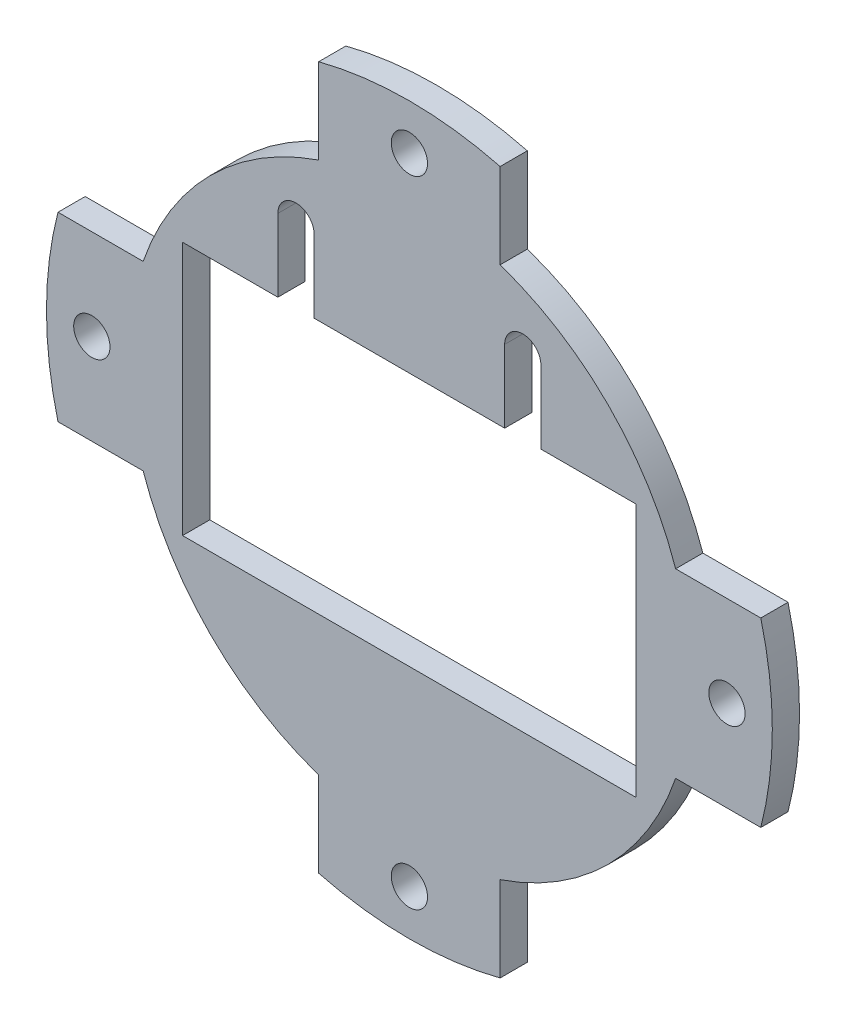
ISO-10303-21;
HEADER;
FILE_DESCRIPTION(('STEP AP214'),'2;1');
FILE_NAME('part.step','',(''),(''),'','','');
FILE_SCHEMA(('AUTOMOTIVE_DESIGN { 1 0 10303 214 1 1 1 1 }'));
ENDSEC;
DATA;
#1=APPLICATION_CONTEXT('core data for automotive mechanical design processes');
#2=APPLICATION_PROTOCOL_DEFINITION('international standard','automotive_design',2000,#1);
#3=PRODUCT_CONTEXT('',#1,'mechanical');
#4=PRODUCT('Part','Part','',(#3));
#5=PRODUCT_RELATED_PRODUCT_CATEGORY('part','',(#4));
#6=PRODUCT_DEFINITION_FORMATION('','',#4);
#7=PRODUCT_DEFINITION_CONTEXT('part definition',#1,'design');
#8=PRODUCT_DEFINITION('design','',#6,#7);
#9=PRODUCT_DEFINITION_SHAPE('','',#8);
#10=(LENGTH_UNIT() NAMED_UNIT(*) SI_UNIT(.MILLI.,.METRE.));
#11=(NAMED_UNIT(*) PLANE_ANGLE_UNIT() SI_UNIT($,.RADIAN.));
#12=(NAMED_UNIT(*) SI_UNIT($,.STERADIAN.) SOLID_ANGLE_UNIT());
#13=UNCERTAINTY_MEASURE_WITH_UNIT(LENGTH_MEASURE(1.E-05),#10,'distance_accuracy_value','');
#14=(GEOMETRIC_REPRESENTATION_CONTEXT(3) GLOBAL_UNCERTAINTY_ASSIGNED_CONTEXT((#13)) GLOBAL_UNIT_ASSIGNED_CONTEXT((#10,
#11,#12)) REPRESENTATION_CONTEXT('',''));
#15=CARTESIAN_POINT('',(0.,0.,0.));
#16=DIRECTION('',(0.,0.,1.));
#17=DIRECTION('',(1.,0.,0.));
#18=AXIS2_PLACEMENT_3D('',#15,#16,#17);
#19=CARTESIAN_POINT('',(25.,14.,-0.00100000000000013));
#20=DIRECTION('',(0.,1.,0.));
#21=DIRECTION('',(-1.,0.,0.));
#22=AXIS2_PLACEMENT_3D('',#19,#20,#21);
#23=PLANE('',#22);
#24=DIRECTION('',(-1.,0.,0.));
#25=VECTOR('',#24,1.);
#26=CARTESIAN_POINT('',(25.,14.,3.));
#27=LINE('',#26,#25);
#28=CARTESIAN_POINT('',(10.5,14.,3.));
#29=VERTEX_POINT('',#28);
#30=CARTESIAN_POINT('',(-10.5,14.,3.));
#31=VERTEX_POINT('',#30);
#32=EDGE_CURVE('E302',#29,#31,#27,.T.);
#33=ORIENTED_EDGE('',*,*,#32,.T.);
#34=DIRECTION('',(0.,0.,1.));
#35=VECTOR('',#34,1.);
#36=CARTESIAN_POINT('',(-10.5,14.,-0.00100000000000013));
#37=LINE('',#36,#35);
#38=CARTESIAN_POINT('',(-10.5,14.,0.));
#39=VERTEX_POINT('',#38);
#40=EDGE_CURVE('E259',#39,#31,#37,.T.);
#41=ORIENTED_EDGE('',*,*,#40,.F.);
#42=DIRECTION('',(1.,0.,0.));
#43=VECTOR('',#42,1.);
#44=CARTESIAN_POINT('',(25.,14.,0.));
#45=LINE('',#44,#43);
#46=CARTESIAN_POINT('',(10.5,14.,0.));
#47=VERTEX_POINT('',#46);
#48=EDGE_CURVE('E286',#39,#47,#45,.T.);
#49=ORIENTED_EDGE('',*,*,#48,.T.);
#50=DIRECTION('',(0.,0.,1.));
#51=VECTOR('',#50,1.);
#52=CARTESIAN_POINT('',(10.5,14.,-0.00100000000000013));
#53=LINE('',#52,#51);
#54=EDGE_CURVE('E278',#47,#29,#53,.T.);
#55=ORIENTED_EDGE('',*,*,#54,.T.);
#56=EDGE_LOOP('',(#33,#41,#49,#55));
#57=FACE_BOUND('',#56,.T.);
#58=ADVANCED_FACE('F33',(#57),#23,.F.);
#59=CARTESIAN_POINT('',(25.,14.,3.));
#60=VERTEX_POINT('',#59);
#61=CARTESIAN_POINT('',(14.5,14.,3.));
#62=VERTEX_POINT('',#61);
#63=EDGE_CURVE('E298',#60,#62,#27,.T.);
#64=ORIENTED_EDGE('',*,*,#63,.T.);
#65=DIRECTION('',(0.,0.,1.));
#66=VECTOR('',#65,1.);
#67=CARTESIAN_POINT('',(14.5,14.,-0.00100000000000013));
#68=LINE('',#67,#66);
#69=CARTESIAN_POINT('',(14.5,14.,0.));
#70=VERTEX_POINT('',#69);
#71=EDGE_CURVE('E276',#70,#62,#68,.T.);
#72=ORIENTED_EDGE('',*,*,#71,.F.);
#73=CARTESIAN_POINT('',(25.,14.,0.));
#74=VERTEX_POINT('',#73);
#75=EDGE_CURVE('E282',#70,#74,#45,.T.);
#76=ORIENTED_EDGE('',*,*,#75,.T.);
#77=DIRECTION('',(0.,0.,1.));
#78=VECTOR('',#77,1.);
#79=CARTESIAN_POINT('',(25.,14.,-0.00100000000000013));
#80=LINE('',#79,#78);
#81=EDGE_CURVE('E307',#74,#60,#80,.T.);
#82=ORIENTED_EDGE('',*,*,#81,.T.);
#83=EDGE_LOOP('',(#64,#72,#76,#82));
#84=FACE_BOUND('',#83,.T.);
#85=ADVANCED_FACE('F452',(#84),#23,.F.);
#86=CARTESIAN_POINT('',(0.,0.,3.));
#87=DIRECTION('',(0.,0.,-1.));
#88=DIRECTION('',(-1.,0.,0.));
#89=AXIS2_PLACEMENT_3D('',#86,#87,#88);
#90=CYLINDRICAL_SURFACE('',#89,40.);
#91=CARTESIAN_POINT('',(0.,0.,0.));
#92=DIRECTION('',(0.,0.,1.));
#93=DIRECTION('',(1.,0.,0.));
#94=AXIS2_PLACEMENT_3D('',#91,#92,#93);
#95=CIRCLE('',#94,40.);
#96=CARTESIAN_POINT('',(10.,38.7298334620742,0.));
#97=VERTEX_POINT('',#96);
#98=CARTESIAN_POINT('',(-10.,38.7298334620742,0.));
#99=VERTEX_POINT('',#98);
#100=EDGE_CURVE('E315',#97,#99,#95,.T.);
#101=ORIENTED_EDGE('',*,*,#100,.T.);
#102=DIRECTION('',(0.,0.,-1.));
#103=VECTOR('',#102,1.);
#104=CARTESIAN_POINT('',(-10.,38.7298334620742,3.));
#105=LINE('',#104,#103);
#106=CARTESIAN_POINT('',(-10.,38.7298334620742,3.));
#107=VERTEX_POINT('',#106);
#108=EDGE_CURVE('E11',#107,#99,#105,.T.);
#109=ORIENTED_EDGE('',*,*,#108,.F.);
#110=CARTESIAN_POINT('',(0.,0.,3.));
#111=DIRECTION('',(0.,0.,1.));
#112=DIRECTION('',(1.,0.,0.));
#113=AXIS2_PLACEMENT_3D('',#110,#111,#112);
#114=CIRCLE('',#113,40.);
#115=CARTESIAN_POINT('',(10.,38.7298334620742,3.));
#116=VERTEX_POINT('',#115);
#117=EDGE_CURVE('E316',#116,#107,#114,.T.);
#118=ORIENTED_EDGE('',*,*,#117,.F.);
#119=DIRECTION('',(0.,0.,-1.));
#120=VECTOR('',#119,1.);
#121=CARTESIAN_POINT('',(10.,38.7298334620742,3.));
#122=LINE('',#121,#120);
#123=EDGE_CURVE('E350',#116,#97,#122,.T.);
#124=ORIENTED_EDGE('',*,*,#123,.T.);
#125=EDGE_LOOP('',(#101,#109,#118,#124));
#126=FACE_BOUND('',#125,.T.);
#127=ADVANCED_FACE('F35',(#126),#90,.T.);
#128=CARTESIAN_POINT('',(-10.,29.3428015022424,3.));
#129=DIRECTION('',(1.,0.,0.));
#130=DIRECTION('',(0.,0.,-1.));
#131=AXIS2_PLACEMENT_3D('',#128,#129,#130);
#132=PLANE('',#131);
#133=DIRECTION('',(0.,-1.,0.));
#134=VECTOR('',#133,1.);
#135=CARTESIAN_POINT('',(-10.,29.3428015022424,0.));
#136=LINE('',#135,#134);
#137=CARTESIAN_POINT('',(-10.,29.3428015022424,0.));
#138=VERTEX_POINT('',#137);
#139=EDGE_CURVE('E353',#99,#138,#136,.T.);
#140=ORIENTED_EDGE('',*,*,#139,.T.);
#141=DIRECTION('',(0.,0.,-1.));
#142=VECTOR('',#141,1.);
#143=CARTESIAN_POINT('',(-10.,29.3428015022424,3.));
#144=LINE('',#143,#142);
#145=CARTESIAN_POINT('',(-10.,29.3428015022424,3.));
#146=VERTEX_POINT('',#145);
#147=EDGE_CURVE('E42',#146,#138,#144,.T.);
#148=ORIENTED_EDGE('',*,*,#147,.F.);
#149=DIRECTION('',(0.,-1.,0.));
#150=VECTOR('',#149,1.);
#151=CARTESIAN_POINT('',(-10.,29.3428015022424,3.));
#152=LINE('',#151,#150);
#153=EDGE_CURVE('E319',#107,#146,#152,.T.);
#154=ORIENTED_EDGE('',*,*,#153,.F.);
#155=ORIENTED_EDGE('',*,*,#108,.T.);
#156=EDGE_LOOP('',(#140,#148,#154,#155));
#157=FACE_BOUND('',#156,.T.);
#158=ADVANCED_FACE('F600',(#157),#132,.F.);
#159=CARTESIAN_POINT('',(0.,0.,3.));
#160=DIRECTION('',(0.,0.,-1.));
#161=DIRECTION('',(-1.,0.,0.));
#162=AXIS2_PLACEMENT_3D('',#159,#160,#161);
#163=CYLINDRICAL_SURFACE('',#162,31.);
#164=CARTESIAN_POINT('',(0.,0.,0.));
#165=DIRECTION('',(0.,0.,1.));
#166=DIRECTION('',(1.,0.,0.));
#167=AXIS2_PLACEMENT_3D('',#164,#165,#166);
#168=CIRCLE('',#167,31.);
#169=CARTESIAN_POINT('',(-29.3428015022423,10.0000000000003,0.));
#170=VERTEX_POINT('',#169);
#171=EDGE_CURVE('E355',#138,#170,#168,.T.);
#172=ORIENTED_EDGE('',*,*,#171,.T.);
#173=DIRECTION('',(0.,0.,-1.));
#174=VECTOR('',#173,1.);
#175=CARTESIAN_POINT('',(-29.3428015022423,10.0000000000003,3.));
#176=LINE('',#175,#174);
#177=CARTESIAN_POINT('',(-29.3428015022423,10.0000000000003,3.));
#178=VERTEX_POINT('',#177);
#179=EDGE_CURVE('E420',#178,#170,#176,.T.);
#180=ORIENTED_EDGE('',*,*,#179,.F.);
#181=CARTESIAN_POINT('',(0.,0.,3.));
#182=DIRECTION('',(0.,0.,1.));
#183=DIRECTION('',(1.,0.,0.));
#184=AXIS2_PLACEMENT_3D('',#181,#182,#183);
#185=CIRCLE('',#184,31.);
#186=EDGE_CURVE('E322',#146,#178,#185,.T.);
#187=ORIENTED_EDGE('',*,*,#186,.F.);
#188=ORIENTED_EDGE('',*,*,#147,.T.);
#189=EDGE_LOOP('',(#172,#180,#187,#188));
#190=FACE_BOUND('',#189,.T.);
#191=ADVANCED_FACE('F597',(#190),#163,.T.);
#192=CARTESIAN_POINT('',(-29.3428015022423,10.0000000000003,3.));
#193=DIRECTION('',(0.,-1.,0.));
#194=DIRECTION('',(1.,0.,0.));
#195=AXIS2_PLACEMENT_3D('',#192,#193,#194);
#196=PLANE('',#195);
#197=DIRECTION('',(-1.,0.,0.));
#198=VECTOR('',#197,1.);
#199=CARTESIAN_POINT('',(-29.3428015022423,10.0000000000003,0.));
#200=LINE('',#199,#198);
#201=CARTESIAN_POINT('',(-38.7298334620741,10.0000000000004,0.));
#202=VERTEX_POINT('',#201);
#203=EDGE_CURVE('E357',#170,#202,#200,.T.);
#204=ORIENTED_EDGE('',*,*,#203,.T.);
#205=DIRECTION('',(0.,0.,-1.));
#206=VECTOR('',#205,1.);
#207=CARTESIAN_POINT('',(-38.7298334620741,10.0000000000004,3.));
#208=LINE('',#207,#206);
#209=CARTESIAN_POINT('',(-38.7298334620741,10.0000000000004,3.));
#210=VERTEX_POINT('',#209);
#211=EDGE_CURVE('E417',#210,#202,#208,.T.);
#212=ORIENTED_EDGE('',*,*,#211,.F.);
#213=DIRECTION('',(-1.,0.,0.));
#214=VECTOR('',#213,1.);
#215=CARTESIAN_POINT('',(-29.3428015022423,10.0000000000003,3.));
#216=LINE('',#215,#214);
#217=EDGE_CURVE('E324',#178,#210,#216,.T.);
#218=ORIENTED_EDGE('',*,*,#217,.F.);
#219=ORIENTED_EDGE('',*,*,#179,.T.);
#220=EDGE_LOOP('',(#204,#212,#218,#219));
#221=FACE_BOUND('',#220,.T.);
#222=ADVANCED_FACE('F593',(#221),#196,.F.);
#223=CARTESIAN_POINT('',(0.,0.,3.));
#224=DIRECTION('',(0.,0.,-1.));
#225=DIRECTION('',(-1.,0.,0.));
#226=AXIS2_PLACEMENT_3D('',#223,#224,#225);
#227=CYLINDRICAL_SURFACE('',#226,40.);
#228=CARTESIAN_POINT('',(0.,0.,0.));
#229=DIRECTION('',(0.,0.,1.));
#230=DIRECTION('',(1.,0.,0.));
#231=AXIS2_PLACEMENT_3D('',#228,#229,#230);
#232=CIRCLE('',#231,40.);
#233=CARTESIAN_POINT('',(-38.7298334620743,-9.99999999999959,0.));
#234=VERTEX_POINT('',#233);
#235=EDGE_CURVE('E359',#202,#234,#232,.T.);
#236=ORIENTED_EDGE('',*,*,#235,.T.);
#237=DIRECTION('',(0.,0.,-1.));
#238=VECTOR('',#237,1.);
#239=CARTESIAN_POINT('',(-38.7298334620743,-9.99999999999959,3.));
#240=LINE('',#239,#238);
#241=CARTESIAN_POINT('',(-38.7298334620743,-9.99999999999959,3.));
#242=VERTEX_POINT('',#241);
#243=EDGE_CURVE('E414',#242,#234,#240,.T.);
#244=ORIENTED_EDGE('',*,*,#243,.F.);
#245=CARTESIAN_POINT('',(0.,0.,3.));
#246=DIRECTION('',(0.,0.,1.));
#247=DIRECTION('',(1.,0.,0.));
#248=AXIS2_PLACEMENT_3D('',#245,#246,#247);
#249=CIRCLE('',#248,40.);
#250=EDGE_CURVE('E326',#210,#242,#249,.T.);
#251=ORIENTED_EDGE('',*,*,#250,.F.);
#252=ORIENTED_EDGE('',*,*,#211,.T.);
#253=EDGE_LOOP('',(#236,#244,#251,#252));
#254=FACE_BOUND('',#253,.T.);
#255=ADVANCED_FACE('F589',(#254),#227,.T.);
#256=CARTESIAN_POINT('',(-29.3428015022425,-9.9999999999997,3.));
#257=DIRECTION('',(0.,1.,0.));
#258=DIRECTION('',(-1.,0.,0.));
#259=AXIS2_PLACEMENT_3D('',#256,#257,#258);
#260=PLANE('',#259);
#261=DIRECTION('',(1.,0.,0.));
#262=VECTOR('',#261,1.);
#263=CARTESIAN_POINT('',(-29.3428015022425,-9.9999999999997,0.));
#264=LINE('',#263,#262);
#265=CARTESIAN_POINT('',(-29.3428015022425,-9.9999999999997,0.));
#266=VERTEX_POINT('',#265);
#267=EDGE_CURVE('E361',#234,#266,#264,.T.);
#268=ORIENTED_EDGE('',*,*,#267,.T.);
#269=DIRECTION('',(0.,0.,-1.));
#270=VECTOR('',#269,1.);
#271=CARTESIAN_POINT('',(-29.3428015022425,-9.9999999999997,3.));
#272=LINE('',#271,#270);
#273=CARTESIAN_POINT('',(-29.3428015022425,-9.9999999999997,3.));
#274=VERTEX_POINT('',#273);
#275=EDGE_CURVE('E411',#274,#266,#272,.T.);
#276=ORIENTED_EDGE('',*,*,#275,.F.);
#277=DIRECTION('',(1.,0.,0.));
#278=VECTOR('',#277,1.);
#279=CARTESIAN_POINT('',(-29.3428015022425,-9.9999999999997,3.));
#280=LINE('',#279,#278);
#281=EDGE_CURVE('E328',#242,#274,#280,.T.);
#282=ORIENTED_EDGE('',*,*,#281,.F.);
#283=ORIENTED_EDGE('',*,*,#243,.T.);
#284=EDGE_LOOP('',(#268,#276,#282,#283));
#285=FACE_BOUND('',#284,.T.);
#286=ADVANCED_FACE('F585',(#285),#260,.F.);
#287=CARTESIAN_POINT('',(0.,0.,3.));
#288=DIRECTION('',(0.,0.,-1.));
#289=DIRECTION('',(-1.,0.,0.));
#290=AXIS2_PLACEMENT_3D('',#287,#288,#289);
#291=CYLINDRICAL_SURFACE('',#290,31.);
#292=CARTESIAN_POINT('',(0.,0.,0.));
#293=DIRECTION('',(0.,0.,1.));
#294=DIRECTION('',(1.,0.,0.));
#295=AXIS2_PLACEMENT_3D('',#292,#293,#294);
#296=CIRCLE('',#295,31.);
#297=CARTESIAN_POINT('',(-10.0000000000002,-29.3428015022423,0.));
#298=VERTEX_POINT('',#297);
#299=EDGE_CURVE('E363',#266,#298,#296,.T.);
#300=ORIENTED_EDGE('',*,*,#299,.T.);
#301=DIRECTION('',(0.,0.,-1.));
#302=VECTOR('',#301,1.);
#303=CARTESIAN_POINT('',(-10.0000000000002,-29.3428015022423,3.));
#304=LINE('',#303,#302);
#305=CARTESIAN_POINT('',(-10.0000000000002,-29.3428015022423,3.));
#306=VERTEX_POINT('',#305);
#307=EDGE_CURVE('E408',#306,#298,#304,.T.);
#308=ORIENTED_EDGE('',*,*,#307,.F.);
#309=CARTESIAN_POINT('',(0.,0.,3.));
#310=DIRECTION('',(0.,0.,1.));
#311=DIRECTION('',(1.,0.,0.));
#312=AXIS2_PLACEMENT_3D('',#309,#310,#311);
#313=CIRCLE('',#312,31.);
#314=EDGE_CURVE('E330',#274,#306,#313,.T.);
#315=ORIENTED_EDGE('',*,*,#314,.F.);
#316=ORIENTED_EDGE('',*,*,#275,.T.);
#317=EDGE_LOOP('',(#300,#308,#315,#316));
#318=FACE_BOUND('',#317,.T.);
#319=ADVANCED_FACE('F581',(#318),#291,.T.);
#320=CARTESIAN_POINT('',(-10.0000000000002,-29.3428015022423,3.));
#321=DIRECTION('',(1.,0.,0.));
#322=DIRECTION('',(0.,1.,0.));
#323=AXIS2_PLACEMENT_3D('',#320,#321,#322);
#324=PLANE('',#323);
#325=DIRECTION('',(0.,-1.,0.));
#326=VECTOR('',#325,1.);
#327=CARTESIAN_POINT('',(-10.0000000000002,-29.3428015022423,0.));
#328=LINE('',#327,#326);
#329=CARTESIAN_POINT('',(-10.0000000000003,-38.7298334620741,0.));
#330=VERTEX_POINT('',#329);
#331=EDGE_CURVE('E365',#298,#330,#328,.T.);
#332=ORIENTED_EDGE('',*,*,#331,.T.);
#333=DIRECTION('',(0.,0.,-1.));
#334=VECTOR('',#333,1.);
#335=CARTESIAN_POINT('',(-10.0000000000003,-38.7298334620741,3.));
#336=LINE('',#335,#334);
#337=CARTESIAN_POINT('',(-10.0000000000003,-38.7298334620741,3.));
#338=VERTEX_POINT('',#337);
#339=EDGE_CURVE('E405',#338,#330,#336,.T.);
#340=ORIENTED_EDGE('',*,*,#339,.F.);
#341=DIRECTION('',(0.,-1.,0.));
#342=VECTOR('',#341,1.);
#343=CARTESIAN_POINT('',(-10.0000000000002,-29.3428015022423,3.));
#344=LINE('',#343,#342);
#345=EDGE_CURVE('E332',#306,#338,#344,.T.);
#346=ORIENTED_EDGE('',*,*,#345,.F.);
#347=ORIENTED_EDGE('',*,*,#307,.T.);
#348=EDGE_LOOP('',(#332,#340,#346,#347));
#349=FACE_BOUND('',#348,.T.);
#350=ADVANCED_FACE('F577',(#349),#324,.F.);
#351=CARTESIAN_POINT('',(0.,0.,3.));
#352=DIRECTION('',(0.,0.,-1.));
#353=DIRECTION('',(-1.,0.,0.));
#354=AXIS2_PLACEMENT_3D('',#351,#352,#353);
#355=CYLINDRICAL_SURFACE('',#354,40.);
#356=CARTESIAN_POINT('',(0.,0.,0.));
#357=DIRECTION('',(0.,0.,1.));
#358=DIRECTION('',(1.,0.,0.));
#359=AXIS2_PLACEMENT_3D('',#356,#357,#358);
#360=CIRCLE('',#359,40.);
#361=CARTESIAN_POINT('',(9.99999999999972,-38.7298334620742,0.));
#362=VERTEX_POINT('',#361);
#363=EDGE_CURVE('E367',#330,#362,#360,.T.);
#364=ORIENTED_EDGE('',*,*,#363,.T.);
#365=DIRECTION('',(0.,0.,-1.));
#366=VECTOR('',#365,1.);
#367=CARTESIAN_POINT('',(9.99999999999972,-38.7298334620742,3.));
#368=LINE('',#367,#366);
#369=CARTESIAN_POINT('',(9.99999999999972,-38.7298334620742,3.));
#370=VERTEX_POINT('',#369);
#371=EDGE_CURVE('E402',#370,#362,#368,.T.);
#372=ORIENTED_EDGE('',*,*,#371,.F.);
#373=CARTESIAN_POINT('',(0.,0.,3.));
#374=DIRECTION('',(0.,0.,1.));
#375=DIRECTION('',(1.,0.,0.));
#376=AXIS2_PLACEMENT_3D('',#373,#374,#375);
#377=CIRCLE('',#376,40.);
#378=EDGE_CURVE('E334',#338,#370,#377,.T.);
#379=ORIENTED_EDGE('',*,*,#378,.F.);
#380=ORIENTED_EDGE('',*,*,#339,.T.);
#381=EDGE_LOOP('',(#364,#372,#379,#380));
#382=FACE_BOUND('',#381,.T.);
#383=ADVANCED_FACE('F573',(#382),#355,.T.);
#384=CARTESIAN_POINT('',(9.9999999999998,-29.3428015022425,3.));
#385=DIRECTION('',(-1.,0.,0.));
#386=DIRECTION('',(0.,-1.,0.));
#387=AXIS2_PLACEMENT_3D('',#384,#385,#386);
#388=PLANE('',#387);
#389=DIRECTION('',(0.,1.,0.));
#390=VECTOR('',#389,1.);
#391=CARTESIAN_POINT('',(9.9999999999998,-29.3428015022425,0.));
#392=LINE('',#391,#390);
#393=CARTESIAN_POINT('',(9.9999999999998,-29.3428015022425,0.));
#394=VERTEX_POINT('',#393);
#395=EDGE_CURVE('E369',#362,#394,#392,.T.);
#396=ORIENTED_EDGE('',*,*,#395,.T.);
#397=DIRECTION('',(0.,0.,-1.));
#398=VECTOR('',#397,1.);
#399=CARTESIAN_POINT('',(9.9999999999998,-29.3428015022425,3.));
#400=LINE('',#399,#398);
#401=CARTESIAN_POINT('',(9.9999999999998,-29.3428015022425,3.));
#402=VERTEX_POINT('',#401);
#403=EDGE_CURVE('E399',#402,#394,#400,.T.);
#404=ORIENTED_EDGE('',*,*,#403,.F.);
#405=DIRECTION('',(0.,1.,0.));
#406=VECTOR('',#405,1.);
#407=CARTESIAN_POINT('',(9.9999999999998,-29.3428015022425,3.));
#408=LINE('',#407,#406);
#409=EDGE_CURVE('E336',#370,#402,#408,.T.);
#410=ORIENTED_EDGE('',*,*,#409,.F.);
#411=ORIENTED_EDGE('',*,*,#371,.T.);
#412=EDGE_LOOP('',(#396,#404,#410,#411));
#413=FACE_BOUND('',#412,.T.);
#414=ADVANCED_FACE('F569',(#413),#388,.F.);
#415=CARTESIAN_POINT('',(0.,0.,3.));
#416=DIRECTION('',(0.,0.,-1.));
#417=DIRECTION('',(-1.,0.,0.));
#418=AXIS2_PLACEMENT_3D('',#415,#416,#417);
#419=CYLINDRICAL_SURFACE('',#418,31.);
#420=CARTESIAN_POINT('',(0.,0.,0.));
#421=DIRECTION('',(0.,0.,1.));
#422=DIRECTION('',(1.,0.,0.));
#423=AXIS2_PLACEMENT_3D('',#420,#421,#422);
#424=CIRCLE('',#423,31.);
#425=CARTESIAN_POINT('',(29.3428015022424,-10.0000000000001,0.));
#426=VERTEX_POINT('',#425);
#427=EDGE_CURVE('E371',#394,#426,#424,.T.);
#428=ORIENTED_EDGE('',*,*,#427,.T.);
#429=DIRECTION('',(0.,0.,-1.));
#430=VECTOR('',#429,1.);
#431=CARTESIAN_POINT('',(29.3428015022424,-10.0000000000001,3.));
#432=LINE('',#431,#430);
#433=CARTESIAN_POINT('',(29.3428015022424,-10.0000000000001,3.));
#434=VERTEX_POINT('',#433);
#435=EDGE_CURVE('E396',#434,#426,#432,.T.);
#436=ORIENTED_EDGE('',*,*,#435,.F.);
#437=CARTESIAN_POINT('',(0.,0.,3.));
#438=DIRECTION('',(0.,0.,1.));
#439=DIRECTION('',(1.,0.,0.));
#440=AXIS2_PLACEMENT_3D('',#437,#438,#439);
#441=CIRCLE('',#440,31.);
#442=EDGE_CURVE('E338',#402,#434,#441,.T.);
#443=ORIENTED_EDGE('',*,*,#442,.F.);
#444=ORIENTED_EDGE('',*,*,#403,.T.);
#445=EDGE_LOOP('',(#428,#436,#443,#444));
#446=FACE_BOUND('',#445,.T.);
#447=ADVANCED_FACE('F565',(#446),#419,.T.);
#448=CARTESIAN_POINT('',(29.3428015022424,-10.0000000000001,3.));
#449=DIRECTION('',(0.,1.,0.));
#450=DIRECTION('',(-1.,0.,0.));
#451=AXIS2_PLACEMENT_3D('',#448,#449,#450);
#452=PLANE('',#451);
#453=DIRECTION('',(1.,0.,0.));
#454=VECTOR('',#453,1.);
#455=CARTESIAN_POINT('',(29.3428015022424,-10.0000000000001,0.));
#456=LINE('',#455,#454);
#457=CARTESIAN_POINT('',(38.7298334620741,-10.0000000000001,0.));
#458=VERTEX_POINT('',#457);
#459=EDGE_CURVE('E373',#426,#458,#456,.T.);
#460=ORIENTED_EDGE('',*,*,#459,.T.);
#461=DIRECTION('',(0.,0.,-1.));
#462=VECTOR('',#461,1.);
#463=CARTESIAN_POINT('',(38.7298334620741,-10.0000000000001,3.));
#464=LINE('',#463,#462);
#465=CARTESIAN_POINT('',(38.7298334620741,-10.0000000000001,3.));
#466=VERTEX_POINT('',#465);
#467=EDGE_CURVE('E393',#466,#458,#464,.T.);
#468=ORIENTED_EDGE('',*,*,#467,.F.);
#469=DIRECTION('',(1.,0.,0.));
#470=VECTOR('',#469,1.);
#471=CARTESIAN_POINT('',(29.3428015022424,-10.0000000000001,3.));
#472=LINE('',#471,#470);
#473=EDGE_CURVE('E340',#434,#466,#472,.T.);
#474=ORIENTED_EDGE('',*,*,#473,.F.);
#475=ORIENTED_EDGE('',*,*,#435,.T.);
#476=EDGE_LOOP('',(#460,#468,#474,#475));
#477=FACE_BOUND('',#476,.T.);
#478=ADVANCED_FACE('F561',(#477),#452,.F.);
#479=CARTESIAN_POINT('',(0.,0.,3.));
#480=DIRECTION('',(0.,0.,-1.));
#481=DIRECTION('',(-1.,0.,0.));
#482=AXIS2_PLACEMENT_3D('',#479,#480,#481);
#483=CYLINDRICAL_SURFACE('',#482,40.);
#484=CARTESIAN_POINT('',(0.,0.,0.));
#485=DIRECTION('',(0.,0.,1.));
#486=DIRECTION('',(1.,0.,0.));
#487=AXIS2_PLACEMENT_3D('',#484,#485,#486);
#488=CIRCLE('',#487,40.);
#489=CARTESIAN_POINT('',(38.7298334620742,9.99999999999987,0.));
#490=VERTEX_POINT('',#489);
#491=EDGE_CURVE('E375',#458,#490,#488,.T.);
#492=ORIENTED_EDGE('',*,*,#491,.T.);
#493=DIRECTION('',(0.,0.,-1.));
#494=VECTOR('',#493,1.);
#495=CARTESIAN_POINT('',(38.7298334620742,9.99999999999987,3.));
#496=LINE('',#495,#494);
#497=CARTESIAN_POINT('',(38.7298334620742,9.99999999999987,3.));
#498=VERTEX_POINT('',#497);
#499=EDGE_CURVE('E390',#498,#490,#496,.T.);
#500=ORIENTED_EDGE('',*,*,#499,.F.);
#501=CARTESIAN_POINT('',(0.,0.,3.));
#502=DIRECTION('',(0.,0.,1.));
#503=DIRECTION('',(1.,0.,0.));
#504=AXIS2_PLACEMENT_3D('',#501,#502,#503);
#505=CIRCLE('',#504,40.);
#506=EDGE_CURVE('E342',#466,#498,#505,.T.);
#507=ORIENTED_EDGE('',*,*,#506,.F.);
#508=ORIENTED_EDGE('',*,*,#467,.T.);
#509=EDGE_LOOP('',(#492,#500,#507,#508));
#510=FACE_BOUND('',#509,.T.);
#511=ADVANCED_FACE('F557',(#510),#483,.T.);
#512=CARTESIAN_POINT('',(29.3428015022425,9.9999999999999,3.));
#513=DIRECTION('',(0.,-1.,0.));
#514=DIRECTION('',(1.,0.,0.));
#515=AXIS2_PLACEMENT_3D('',#512,#513,#514);
#516=PLANE('',#515);
#517=DIRECTION('',(-1.,0.,0.));
#518=VECTOR('',#517,1.);
#519=CARTESIAN_POINT('',(29.3428015022425,9.9999999999999,0.));
#520=LINE('',#519,#518);
#521=CARTESIAN_POINT('',(29.3428015022425,9.9999999999999,0.));
#522=VERTEX_POINT('',#521);
#523=EDGE_CURVE('E377',#490,#522,#520,.T.);
#524=ORIENTED_EDGE('',*,*,#523,.T.);
#525=DIRECTION('',(0.,0.,-1.));
#526=VECTOR('',#525,1.);
#527=CARTESIAN_POINT('',(29.3428015022425,9.9999999999999,3.));
#528=LINE('',#527,#526);
#529=CARTESIAN_POINT('',(29.3428015022425,9.9999999999999,3.));
#530=VERTEX_POINT('',#529);
#531=EDGE_CURVE('E387',#530,#522,#528,.T.);
#532=ORIENTED_EDGE('',*,*,#531,.F.);
#533=DIRECTION('',(-1.,0.,0.));
#534=VECTOR('',#533,1.);
#535=CARTESIAN_POINT('',(29.3428015022425,9.9999999999999,3.));
#536=LINE('',#535,#534);
#537=EDGE_CURVE('E344',#498,#530,#536,.T.);
#538=ORIENTED_EDGE('',*,*,#537,.F.);
#539=ORIENTED_EDGE('',*,*,#499,.T.);
#540=EDGE_LOOP('',(#524,#532,#538,#539));
#541=FACE_BOUND('',#540,.T.);
#542=ADVANCED_FACE('F553',(#541),#516,.F.);
#543=CARTESIAN_POINT('',(0.,0.,3.));
#544=DIRECTION('',(0.,0.,-1.));
#545=DIRECTION('',(-1.,0.,0.));
#546=AXIS2_PLACEMENT_3D('',#543,#544,#545);
#547=CYLINDRICAL_SURFACE('',#546,31.);
#548=CARTESIAN_POINT('',(0.,0.,0.));
#549=DIRECTION('',(0.,0.,1.));
#550=DIRECTION('',(1.,0.,0.));
#551=AXIS2_PLACEMENT_3D('',#548,#549,#550);
#552=CIRCLE('',#551,31.);
#553=CARTESIAN_POINT('',(10.,29.3428015022424,0.));
#554=VERTEX_POINT('',#553);
#555=EDGE_CURVE('E379',#522,#554,#552,.T.);
#556=ORIENTED_EDGE('',*,*,#555,.T.);
#557=DIRECTION('',(0.,0.,-1.));
#558=VECTOR('',#557,1.);
#559=CARTESIAN_POINT('',(10.,29.3428015022424,3.));
#560=LINE('',#559,#558);
#561=CARTESIAN_POINT('',(10.,29.3428015022424,3.));
#562=VERTEX_POINT('',#561);
#563=EDGE_CURVE('E384',#562,#554,#560,.T.);
#564=ORIENTED_EDGE('',*,*,#563,.F.);
#565=CARTESIAN_POINT('',(0.,0.,3.));
#566=DIRECTION('',(0.,0.,1.));
#567=DIRECTION('',(1.,0.,0.));
#568=AXIS2_PLACEMENT_3D('',#565,#566,#567);
#569=CIRCLE('',#568,31.);
#570=EDGE_CURVE('E346',#530,#562,#569,.T.);
#571=ORIENTED_EDGE('',*,*,#570,.F.);
#572=ORIENTED_EDGE('',*,*,#531,.T.);
#573=EDGE_LOOP('',(#556,#564,#571,#572));
#574=FACE_BOUND('',#573,.T.);
#575=ADVANCED_FACE('F549',(#574),#547,.T.);
#576=CARTESIAN_POINT('',(10.,29.3428015022424,3.));
#577=DIRECTION('',(-1.,0.,0.));
#578=DIRECTION('',(0.,0.,1.));
#579=AXIS2_PLACEMENT_3D('',#576,#577,#578);
#580=PLANE('',#579);
#581=DIRECTION('',(0.,1.,0.));
#582=VECTOR('',#581,1.);
#583=CARTESIAN_POINT('',(10.,29.3428015022424,0.));
#584=LINE('',#583,#582);
#585=EDGE_CURVE('E320',#554,#97,#584,.T.);
#586=ORIENTED_EDGE('',*,*,#585,.T.);
#587=ORIENTED_EDGE('',*,*,#123,.F.);
#588=DIRECTION('',(0.,1.,0.));
#589=VECTOR('',#588,1.);
#590=CARTESIAN_POINT('',(10.,29.3428015022424,3.));
#591=LINE('',#590,#589);
#592=EDGE_CURVE('E348',#562,#116,#591,.T.);
#593=ORIENTED_EDGE('',*,*,#592,.F.);
#594=ORIENTED_EDGE('',*,*,#563,.T.);
#595=EDGE_LOOP('',(#586,#587,#593,#594));
#596=FACE_BOUND('',#595,.T.);
#597=ADVANCED_FACE('F543',(#596),#580,.F.);
#598=CARTESIAN_POINT('',(0.,0.,3.));
#599=DIRECTION('',(0.,0.,1.));
#600=DIRECTION('',(1.,0.,0.));
#601=AXIS2_PLACEMENT_3D('',#598,#599,#600);
#602=PLANE('',#601);
#603=CARTESIAN_POINT('',(0.,35.,3.));
#604=DIRECTION('',(0.,0.,1.));
#605=DIRECTION('',(1.,0.,0.));
#606=AXIS2_PLACEMENT_3D('',#603,#604,#605);
#607=CIRCLE('',#606,2.);
#608=CARTESIAN_POINT('',(2.,35.,3.));
#609=VERTEX_POINT('',#608);
#610=EDGE_CURVE('E429',#609,#609,#607,.T.);
#611=ORIENTED_EDGE('',*,*,#610,.F.);
#612=EDGE_LOOP('',(#611));
#613=FACE_BOUND('',#612,.T.);
#614=CARTESIAN_POINT('',(35.000000000001,9.90473566267125E-13,3.));
#615=DIRECTION('',(0.,0.,1.));
#616=DIRECTION('',(1.,0.,0.));
#617=AXIS2_PLACEMENT_3D('',#614,#615,#616);
#618=CIRCLE('',#617,2.00000000000077);
#619=CARTESIAN_POINT('',(37.0000000000018,9.90473566267125E-13,3.));
#620=VERTEX_POINT('',#619);
#621=EDGE_CURVE('E851',#620,#620,#618,.T.);
#622=ORIENTED_EDGE('',*,*,#621,.F.);
#623=EDGE_LOOP('',(#622));
#624=FACE_BOUND('',#623,.T.);
#625=CARTESIAN_POINT('',(1.98094713253425E-12,-35.,3.));
#626=DIRECTION('',(0.,0.,1.));
#627=DIRECTION('',(1.,0.,0.));
#628=AXIS2_PLACEMENT_3D('',#625,#626,#627);
#629=CIRCLE('',#628,2.00000000000213);
#630=CARTESIAN_POINT('',(2.00000000000411,-35.,3.));
#631=VERTEX_POINT('',#630);
#632=EDGE_CURVE('E532',#631,#631,#629,.T.);
#633=ORIENTED_EDGE('',*,*,#632,.F.);
#634=EDGE_LOOP('',(#633));
#635=FACE_BOUND('',#634,.T.);
#636=CARTESIAN_POINT('',(-34.999999999999,-9.9475983006414E-13,3.));
#637=DIRECTION('',(0.,0.,1.));
#638=DIRECTION('',(1.,0.,0.));
#639=AXIS2_PLACEMENT_3D('',#636,#637,#638);
#640=CIRCLE('',#639,2.00000000000159);
#641=CARTESIAN_POINT('',(-32.9999999999974,-9.9475983006414E-13,3.));
#642=VERTEX_POINT('',#641);
#643=EDGE_CURVE('E251',#642,#642,#640,.T.);
#644=ORIENTED_EDGE('',*,*,#643,.F.);
#645=EDGE_LOOP('',(#644));
#646=FACE_BOUND('',#645,.T.);
#647=DIRECTION('',(0.,1.,0.));
#648=VECTOR('',#647,1.);
#649=CARTESIAN_POINT('',(-10.5,22.,3.));
#650=LINE('',#649,#648);
#651=CARTESIAN_POINT('',(-10.5,22.,3.));
#652=VERTEX_POINT('',#651);
#653=EDGE_CURVE('E229',#31,#652,#650,.T.);
#654=ORIENTED_EDGE('',*,*,#653,.F.);
#655=ORIENTED_EDGE('',*,*,#32,.F.);
#656=DIRECTION('',(0.,-1.,0.));
#657=VECTOR('',#656,1.);
#658=CARTESIAN_POINT('',(10.5,22.,3.));
#659=LINE('',#658,#657);
#660=CARTESIAN_POINT('',(10.5,22.,3.));
#661=VERTEX_POINT('',#660);
#662=EDGE_CURVE('E58',#661,#29,#659,.T.);
#663=ORIENTED_EDGE('',*,*,#662,.F.);
#664=CARTESIAN_POINT('',(12.5,22.,3.));
#665=DIRECTION('',(0.,0.,1.));
#666=DIRECTION('',(-1.,0.,0.));
#667=AXIS2_PLACEMENT_3D('',#664,#665,#666);
#668=CIRCLE('',#667,2.);
#669=CARTESIAN_POINT('',(14.5,22.,3.));
#670=VERTEX_POINT('',#669);
#671=EDGE_CURVE('E267',#670,#661,#668,.T.);
#672=ORIENTED_EDGE('',*,*,#671,.F.);
#673=DIRECTION('',(0.,1.,0.));
#674=VECTOR('',#673,1.);
#675=CARTESIAN_POINT('',(14.5,22.,3.));
#676=LINE('',#675,#674);
#677=EDGE_CURVE('E271',#62,#670,#676,.T.);
#678=ORIENTED_EDGE('',*,*,#677,.F.);
#679=ORIENTED_EDGE('',*,*,#63,.F.);
#680=DIRECTION('',(0.,1.,0.));
#681=VECTOR('',#680,1.);
#682=CARTESIAN_POINT('',(25.,14.,3.));
#683=LINE('',#682,#681);
#684=CARTESIAN_POINT('',(25.,-14.,3.));
#685=VERTEX_POINT('',#684);
#686=EDGE_CURVE('E294',#685,#60,#683,.T.);
#687=ORIENTED_EDGE('',*,*,#686,.F.);
#688=DIRECTION('',(1.,0.,0.));
#689=VECTOR('',#688,1.);
#690=CARTESIAN_POINT('',(25.,-14.,3.));
#691=LINE('',#690,#689);
#692=CARTESIAN_POINT('',(-25.,-14.,3.));
#693=VERTEX_POINT('',#692);
#694=EDGE_CURVE('E291',#693,#685,#691,.T.);
#695=ORIENTED_EDGE('',*,*,#694,.F.);
#696=DIRECTION('',(0.,-1.,0.));
#697=VECTOR('',#696,1.);
#698=CARTESIAN_POINT('',(-25.,14.,3.));
#699=LINE('',#698,#697);
#700=CARTESIAN_POINT('',(-25.,14.,3.));
#701=VERTEX_POINT('',#700);
#702=EDGE_CURVE('E289',#701,#693,#699,.T.);
#703=ORIENTED_EDGE('',*,*,#702,.F.);
#704=CARTESIAN_POINT('',(-14.5,14.,3.));
#705=VERTEX_POINT('',#704);
#706=EDGE_CURVE('E297',#705,#701,#27,.T.);
#707=ORIENTED_EDGE('',*,*,#706,.F.);
#708=DIRECTION('',(0.,-1.,0.));
#709=VECTOR('',#708,1.);
#710=CARTESIAN_POINT('',(-14.5,22.,3.));
#711=LINE('',#710,#709);
#712=CARTESIAN_POINT('',(-14.5,22.,3.));
#713=VERTEX_POINT('',#712);
#714=EDGE_CURVE('E50',#713,#705,#711,.T.);
#715=ORIENTED_EDGE('',*,*,#714,.F.);
#716=CARTESIAN_POINT('',(-12.5,22.,3.));
#717=DIRECTION('',(0.,0.,1.));
#718=DIRECTION('',(1.,0.,0.));
#719=AXIS2_PLACEMENT_3D('',#716,#717,#718);
#720=CIRCLE('',#719,2.);
#721=EDGE_CURVE('E227',#652,#713,#720,.T.);
#722=ORIENTED_EDGE('',*,*,#721,.F.);
#723=EDGE_LOOP('',(#654,#655,#663,#672,#678,#679,#687,#695,#703,#707,#715,#722));
#724=FACE_BOUND('',#723,.T.);
#725=ORIENTED_EDGE('',*,*,#117,.T.);
#726=ORIENTED_EDGE('',*,*,#153,.T.);
#727=ORIENTED_EDGE('',*,*,#186,.T.);
#728=ORIENTED_EDGE('',*,*,#217,.T.);
#729=ORIENTED_EDGE('',*,*,#250,.T.);
#730=ORIENTED_EDGE('',*,*,#281,.T.);
#731=ORIENTED_EDGE('',*,*,#314,.T.);
#732=ORIENTED_EDGE('',*,*,#345,.T.);
#733=ORIENTED_EDGE('',*,*,#378,.T.);
#734=ORIENTED_EDGE('',*,*,#409,.T.);
#735=ORIENTED_EDGE('',*,*,#442,.T.);
#736=ORIENTED_EDGE('',*,*,#473,.T.);
#737=ORIENTED_EDGE('',*,*,#506,.T.);
#738=ORIENTED_EDGE('',*,*,#537,.T.);
#739=ORIENTED_EDGE('',*,*,#570,.T.);
#740=ORIENTED_EDGE('',*,*,#592,.T.);
#741=EDGE_LOOP('',(#725,#726,#727,#728,#729,#730,#731,#732,#733,#734,#735,#736,#737,#738,#739,#740));
#742=FACE_BOUND('',#741,.T.);
#743=ADVANCED_FACE('F501',(#613,#624,#635,#646,#724,#742),#602,.T.);
#744=CARTESIAN_POINT('',(0.,0.,0.));
#745=DIRECTION('',(0.,0.,1.));
#746=DIRECTION('',(1.,0.,0.));
#747=AXIS2_PLACEMENT_3D('',#744,#745,#746);
#748=PLANE('',#747);
#749=CARTESIAN_POINT('',(0.,35.,0.));
#750=DIRECTION('',(0.,0.,1.));
#751=DIRECTION('',(1.,0.,0.));
#752=AXIS2_PLACEMENT_3D('',#749,#750,#751);
#753=CIRCLE('',#752,2.);
#754=CARTESIAN_POINT('',(2.,35.,0.));
#755=VERTEX_POINT('',#754);
#756=EDGE_CURVE('E37',#755,#755,#753,.T.);
#757=ORIENTED_EDGE('',*,*,#756,.T.);
#758=EDGE_LOOP('',(#757));
#759=FACE_BOUND('',#758,.T.);
#760=CARTESIAN_POINT('',(35.000000000001,9.90473566267125E-13,0.));
#761=DIRECTION('',(0.,0.,1.));
#762=DIRECTION('',(1.,0.,0.));
#763=AXIS2_PLACEMENT_3D('',#760,#761,#762);
#764=CIRCLE('',#763,2.00000000000077);
#765=CARTESIAN_POINT('',(37.0000000000018,9.90473566267125E-13,0.));
#766=VERTEX_POINT('',#765);
#767=EDGE_CURVE('E431',#766,#766,#764,.T.);
#768=ORIENTED_EDGE('',*,*,#767,.T.);
#769=EDGE_LOOP('',(#768));
#770=FACE_BOUND('',#769,.T.);
#771=CARTESIAN_POINT('',(1.98094713253425E-12,-35.,0.));
#772=DIRECTION('',(0.,0.,1.));
#773=DIRECTION('',(1.,0.,0.));
#774=AXIS2_PLACEMENT_3D('',#771,#772,#773);
#775=CIRCLE('',#774,2.00000000000213);
#776=CARTESIAN_POINT('',(2.00000000000411,-35.,0.));
#777=VERTEX_POINT('',#776);
#778=EDGE_CURVE('E428',#777,#777,#775,.T.);
#779=ORIENTED_EDGE('',*,*,#778,.T.);
#780=EDGE_LOOP('',(#779));
#781=FACE_BOUND('',#780,.T.);
#782=CARTESIAN_POINT('',(-34.999999999999,-9.9475983006414E-13,0.));
#783=DIRECTION('',(0.,0.,1.));
#784=DIRECTION('',(1.,0.,0.));
#785=AXIS2_PLACEMENT_3D('',#782,#783,#784);
#786=CIRCLE('',#785,2.00000000000159);
#787=CARTESIAN_POINT('',(-32.9999999999974,-9.9475983006414E-13,0.));
#788=VERTEX_POINT('',#787);
#789=EDGE_CURVE('E425',#788,#788,#786,.T.);
#790=ORIENTED_EDGE('',*,*,#789,.T.);
#791=EDGE_LOOP('',(#790));
#792=FACE_BOUND('',#791,.T.);
#793=ORIENTED_EDGE('',*,*,#48,.F.);
#794=DIRECTION('',(0.,-1.,0.));
#795=VECTOR('',#794,1.);
#796=CARTESIAN_POINT('',(-10.5,22.,0.));
#797=LINE('',#796,#795);
#798=CARTESIAN_POINT('',(-10.5,22.,0.));
#799=VERTEX_POINT('',#798);
#800=EDGE_CURVE('E243',#799,#39,#797,.T.);
#801=ORIENTED_EDGE('',*,*,#800,.F.);
#802=CARTESIAN_POINT('',(-12.5,22.,0.));
#803=DIRECTION('',(0.,0.,1.));
#804=DIRECTION('',(1.,0.,0.));
#805=AXIS2_PLACEMENT_3D('',#802,#803,#804);
#806=CIRCLE('',#805,2.);
#807=CARTESIAN_POINT('',(-14.5,22.,0.));
#808=VERTEX_POINT('',#807);
#809=EDGE_CURVE('E224',#808,#799,#806,.F.);
#810=ORIENTED_EDGE('',*,*,#809,.F.);
#811=DIRECTION('',(0.,1.,0.));
#812=VECTOR('',#811,1.);
#813=CARTESIAN_POINT('',(-14.5,22.,0.));
#814=LINE('',#813,#812);
#815=CARTESIAN_POINT('',(-14.5,14.,0.));
#816=VERTEX_POINT('',#815);
#817=EDGE_CURVE('E232',#816,#808,#814,.T.);
#818=ORIENTED_EDGE('',*,*,#817,.F.);
#819=CARTESIAN_POINT('',(-25.,14.,0.));
#820=VERTEX_POINT('',#819);
#821=EDGE_CURVE('E283',#820,#816,#45,.T.);
#822=ORIENTED_EDGE('',*,*,#821,.F.);
#823=DIRECTION('',(0.,1.,0.));
#824=VECTOR('',#823,1.);
#825=CARTESIAN_POINT('',(-25.,14.,0.));
#826=LINE('',#825,#824);
#827=CARTESIAN_POINT('',(-25.,-14.,0.));
#828=VERTEX_POINT('',#827);
#829=EDGE_CURVE('E285',#828,#820,#826,.T.);
#830=ORIENTED_EDGE('',*,*,#829,.F.);
#831=DIRECTION('',(-1.,0.,0.));
#832=VECTOR('',#831,1.);
#833=CARTESIAN_POINT('',(25.,-14.,0.));
#834=LINE('',#833,#832);
#835=CARTESIAN_POINT('',(25.,-14.,0.));
#836=VERTEX_POINT('',#835);
#837=EDGE_CURVE('E306',#836,#828,#834,.T.);
#838=ORIENTED_EDGE('',*,*,#837,.F.);
#839=DIRECTION('',(0.,-1.,0.));
#840=VECTOR('',#839,1.);
#841=CARTESIAN_POINT('',(25.,14.,0.));
#842=LINE('',#841,#840);
#843=EDGE_CURVE('E237',#74,#836,#842,.T.);
#844=ORIENTED_EDGE('',*,*,#843,.F.);
#845=ORIENTED_EDGE('',*,*,#75,.F.);
#846=DIRECTION('',(0.,-1.,0.));
#847=VECTOR('',#846,1.);
#848=CARTESIAN_POINT('',(14.5,22.,0.));
#849=LINE('',#848,#847);
#850=CARTESIAN_POINT('',(14.5,22.,0.));
#851=VERTEX_POINT('',#850);
#852=EDGE_CURVE('E265',#851,#70,#849,.T.);
#853=ORIENTED_EDGE('',*,*,#852,.F.);
#854=CARTESIAN_POINT('',(12.5,22.,0.));
#855=DIRECTION('',(0.,0.,1.));
#856=DIRECTION('',(1.,0.,0.));
#857=AXIS2_PLACEMENT_3D('',#854,#855,#856);
#858=CIRCLE('',#857,2.);
#859=CARTESIAN_POINT('',(10.5,22.,0.));
#860=VERTEX_POINT('',#859);
#861=EDGE_CURVE('E262',#860,#851,#858,.F.);
#862=ORIENTED_EDGE('',*,*,#861,.F.);
#863=DIRECTION('',(0.,1.,0.));
#864=VECTOR('',#863,1.);
#865=CARTESIAN_POINT('',(10.5,22.,0.));
#866=LINE('',#865,#864);
#867=EDGE_CURVE('E244',#47,#860,#866,.T.);
#868=ORIENTED_EDGE('',*,*,#867,.F.);
#869=EDGE_LOOP('',(#793,#801,#810,#818,#822,#830,#838,#844,#845,#853,#862,#868));
#870=FACE_BOUND('',#869,.T.);
#871=ORIENTED_EDGE('',*,*,#100,.F.);
#872=ORIENTED_EDGE('',*,*,#585,.F.);
#873=ORIENTED_EDGE('',*,*,#555,.F.);
#874=ORIENTED_EDGE('',*,*,#523,.F.);
#875=ORIENTED_EDGE('',*,*,#491,.F.);
#876=ORIENTED_EDGE('',*,*,#459,.F.);
#877=ORIENTED_EDGE('',*,*,#427,.F.);
#878=ORIENTED_EDGE('',*,*,#395,.F.);
#879=ORIENTED_EDGE('',*,*,#363,.F.);
#880=ORIENTED_EDGE('',*,*,#331,.F.);
#881=ORIENTED_EDGE('',*,*,#299,.F.);
#882=ORIENTED_EDGE('',*,*,#267,.F.);
#883=ORIENTED_EDGE('',*,*,#235,.F.);
#884=ORIENTED_EDGE('',*,*,#203,.F.);
#885=ORIENTED_EDGE('',*,*,#171,.F.);
#886=ORIENTED_EDGE('',*,*,#139,.F.);
#887=EDGE_LOOP('',(#871,#872,#873,#874,#875,#876,#877,#878,#879,#880,#881,#882,#883,#884,#885,#886));
#888=FACE_BOUND('',#887,.T.);
#889=ADVANCED_FACE('F241',(#759,#770,#781,#792,#870,#888),#748,.F.);
#890=CARTESIAN_POINT('',(-25.,14.,-0.00100000000000013));
#891=DIRECTION('',(-1.,0.,0.));
#892=DIRECTION('',(0.,-1.,0.));
#893=AXIS2_PLACEMENT_3D('',#890,#891,#892);
#894=PLANE('',#893);
#895=ORIENTED_EDGE('',*,*,#829,.T.);
#896=DIRECTION('',(0.,0.,1.));
#897=VECTOR('',#896,1.);
#898=CARTESIAN_POINT('',(-25.,14.,-0.00100000000000013));
#899=LINE('',#898,#897);
#900=EDGE_CURVE('E303',#820,#701,#899,.T.);
#901=ORIENTED_EDGE('',*,*,#900,.T.);
#902=ORIENTED_EDGE('',*,*,#702,.T.);
#903=DIRECTION('',(0.,0.,1.));
#904=VECTOR('',#903,1.);
#905=CARTESIAN_POINT('',(-25.,-14.,-0.00100000000000013));
#906=LINE('',#905,#904);
#907=EDGE_CURVE('E301',#828,#693,#906,.T.);
#908=ORIENTED_EDGE('',*,*,#907,.F.);
#909=EDGE_LOOP('',(#895,#901,#902,#908));
#910=FACE_BOUND('',#909,.T.);
#911=ADVANCED_FACE('F465',(#910),#894,.F.);
#912=ORIENTED_EDGE('',*,*,#821,.T.);
#913=DIRECTION('',(0.,0.,1.));
#914=VECTOR('',#913,1.);
#915=CARTESIAN_POINT('',(-14.5,14.,-0.00100000000000013));
#916=LINE('',#915,#914);
#917=EDGE_CURVE('E228',#816,#705,#916,.T.);
#918=ORIENTED_EDGE('',*,*,#917,.T.);
#919=ORIENTED_EDGE('',*,*,#706,.T.);
#920=ORIENTED_EDGE('',*,*,#900,.F.);
#921=EDGE_LOOP('',(#912,#918,#919,#920));
#922=FACE_BOUND('',#921,.T.);
#923=ADVANCED_FACE('F455',(#922),#23,.F.);
#924=CARTESIAN_POINT('',(25.,14.,-0.00100000000000013));
#925=DIRECTION('',(1.,0.,0.));
#926=DIRECTION('',(0.,1.,0.));
#927=AXIS2_PLACEMENT_3D('',#924,#925,#926);
#928=PLANE('',#927);
#929=ORIENTED_EDGE('',*,*,#843,.T.);
#930=DIRECTION('',(0.,0.,1.));
#931=VECTOR('',#930,1.);
#932=CARTESIAN_POINT('',(25.,-14.,-0.00100000000000013));
#933=LINE('',#932,#931);
#934=EDGE_CURVE('E309',#836,#685,#933,.T.);
#935=ORIENTED_EDGE('',*,*,#934,.T.);
#936=ORIENTED_EDGE('',*,*,#686,.T.);
#937=ORIENTED_EDGE('',*,*,#81,.F.);
#938=EDGE_LOOP('',(#929,#935,#936,#937));
#939=FACE_BOUND('',#938,.T.);
#940=ADVANCED_FACE('F464',(#939),#928,.F.);
#941=CARTESIAN_POINT('',(25.,-14.,-0.00100000000000013));
#942=DIRECTION('',(0.,-1.,0.));
#943=DIRECTION('',(1.,0.,0.));
#944=AXIS2_PLACEMENT_3D('',#941,#942,#943);
#945=PLANE('',#944);
#946=ORIENTED_EDGE('',*,*,#837,.T.);
#947=ORIENTED_EDGE('',*,*,#907,.T.);
#948=ORIENTED_EDGE('',*,*,#694,.T.);
#949=ORIENTED_EDGE('',*,*,#934,.F.);
#950=EDGE_LOOP('',(#946,#947,#948,#949));
#951=FACE_BOUND('',#950,.T.);
#952=ADVANCED_FACE('F471',(#951),#945,.F.);
#953=CARTESIAN_POINT('',(12.5,22.,-0.00100000000000013));
#954=DIRECTION('',(0.,0.,1.));
#955=DIRECTION('',(1.,0.,0.));
#956=AXIS2_PLACEMENT_3D('',#953,#954,#955);
#957=CYLINDRICAL_SURFACE('',#956,2.);
#958=ORIENTED_EDGE('',*,*,#861,.T.);
#959=DIRECTION('',(0.,0.,1.));
#960=VECTOR('',#959,1.);
#961=CARTESIAN_POINT('',(14.5,22.,-0.00100000000000013));
#962=LINE('',#961,#960);
#963=EDGE_CURVE('E248',#851,#670,#962,.T.);
#964=ORIENTED_EDGE('',*,*,#963,.T.);
#965=ORIENTED_EDGE('',*,*,#671,.T.);
#966=DIRECTION('',(0.,0.,1.));
#967=VECTOR('',#966,1.);
#968=CARTESIAN_POINT('',(10.5,22.,-0.00100000000000013));
#969=LINE('',#968,#967);
#970=EDGE_CURVE('E274',#860,#661,#969,.T.);
#971=ORIENTED_EDGE('',*,*,#970,.F.);
#972=EDGE_LOOP('',(#958,#964,#965,#971));
#973=FACE_BOUND('',#972,.T.);
#974=ADVANCED_FACE('F497',(#973),#957,.F.);
#975=CARTESIAN_POINT('',(14.5,22.,-0.00100000000000013));
#976=DIRECTION('',(1.,0.,0.));
#977=DIRECTION('',(0.,1.,0.));
#978=AXIS2_PLACEMENT_3D('',#975,#976,#977);
#979=PLANE('',#978);
#980=ORIENTED_EDGE('',*,*,#852,.T.);
#981=ORIENTED_EDGE('',*,*,#71,.T.);
#982=ORIENTED_EDGE('',*,*,#677,.T.);
#983=ORIENTED_EDGE('',*,*,#963,.F.);
#984=EDGE_LOOP('',(#980,#981,#982,#983));
#985=FACE_BOUND('',#984,.T.);
#986=ADVANCED_FACE('F504',(#985),#979,.F.);
#987=CARTESIAN_POINT('',(10.5,22.,-0.00100000000000013));
#988=DIRECTION('',(-1.,0.,0.));
#989=DIRECTION('',(0.,-1.,0.));
#990=AXIS2_PLACEMENT_3D('',#987,#988,#989);
#991=PLANE('',#990);
#992=ORIENTED_EDGE('',*,*,#867,.T.);
#993=ORIENTED_EDGE('',*,*,#970,.T.);
#994=ORIENTED_EDGE('',*,*,#662,.T.);
#995=ORIENTED_EDGE('',*,*,#54,.F.);
#996=EDGE_LOOP('',(#992,#993,#994,#995));
#997=FACE_BOUND('',#996,.T.);
#998=ADVANCED_FACE('F494',(#997),#991,.F.);
#999=CARTESIAN_POINT('',(-12.5,22.,-0.00100000000000013));
#1000=DIRECTION('',(0.,0.,1.));
#1001=DIRECTION('',(1.,0.,0.));
#1002=AXIS2_PLACEMENT_3D('',#999,#1000,#1001);
#1003=CYLINDRICAL_SURFACE('',#1002,2.);
#1004=ORIENTED_EDGE('',*,*,#809,.T.);
#1005=DIRECTION('',(0.,0.,1.));
#1006=VECTOR('',#1005,1.);
#1007=CARTESIAN_POINT('',(-10.5,22.,-0.00100000000000013));
#1008=LINE('',#1007,#1006);
#1009=EDGE_CURVE('E238',#799,#652,#1008,.T.);
#1010=ORIENTED_EDGE('',*,*,#1009,.T.);
#1011=ORIENTED_EDGE('',*,*,#721,.T.);
#1012=DIRECTION('',(0.,0.,1.));
#1013=VECTOR('',#1012,1.);
#1014=CARTESIAN_POINT('',(-14.5,22.,-0.00100000000000013));
#1015=LINE('',#1014,#1013);
#1016=EDGE_CURVE('E220',#808,#713,#1015,.T.);
#1017=ORIENTED_EDGE('',*,*,#1016,.F.);
#1018=EDGE_LOOP('',(#1004,#1010,#1011,#1017));
#1019=FACE_BOUND('',#1018,.T.);
#1020=ADVANCED_FACE('F222',(#1019),#1003,.F.);
#1021=CARTESIAN_POINT('',(-10.5,22.,-0.00100000000000013));
#1022=DIRECTION('',(1.,0.,0.));
#1023=DIRECTION('',(0.,1.,0.));
#1024=AXIS2_PLACEMENT_3D('',#1021,#1022,#1023);
#1025=PLANE('',#1024);
#1026=ORIENTED_EDGE('',*,*,#800,.T.);
#1027=ORIENTED_EDGE('',*,*,#40,.T.);
#1028=ORIENTED_EDGE('',*,*,#653,.T.);
#1029=ORIENTED_EDGE('',*,*,#1009,.F.);
#1030=EDGE_LOOP('',(#1026,#1027,#1028,#1029));
#1031=FACE_BOUND('',#1030,.T.);
#1032=ADVANCED_FACE('F515',(#1031),#1025,.F.);
#1033=CARTESIAN_POINT('',(-14.5,22.,-0.00100000000000013));
#1034=DIRECTION('',(-1.,0.,0.));
#1035=DIRECTION('',(0.,-1.,0.));
#1036=AXIS2_PLACEMENT_3D('',#1033,#1034,#1035);
#1037=PLANE('',#1036);
#1038=ORIENTED_EDGE('',*,*,#817,.T.);
#1039=ORIENTED_EDGE('',*,*,#1016,.T.);
#1040=ORIENTED_EDGE('',*,*,#714,.T.);
#1041=ORIENTED_EDGE('',*,*,#917,.F.);
#1042=EDGE_LOOP('',(#1038,#1039,#1040,#1041));
#1043=FACE_BOUND('',#1042,.T.);
#1044=ADVANCED_FACE('F233',(#1043),#1037,.F.);
#1045=CARTESIAN_POINT('',(-34.999999999999,-9.9475983006414E-13,-7.));
#1046=DIRECTION('',(0.,0.,1.));
#1047=DIRECTION('',(1.,0.,0.));
#1048=AXIS2_PLACEMENT_3D('',#1045,#1046,#1047);
#1049=CYLINDRICAL_SURFACE('',#1048,2.00000000000159);
#1050=ORIENTED_EDGE('',*,*,#643,.T.);
#1051=EDGE_LOOP('',(#1050));
#1052=FACE_BOUND('',#1051,.T.);
#1053=ORIENTED_EDGE('',*,*,#789,.F.);
#1054=EDGE_LOOP('',(#1053));
#1055=FACE_BOUND('',#1054,.T.);
#1056=ADVANCED_FACE('F518',(#1052,#1055),#1049,.F.);
#1057=CARTESIAN_POINT('',(1.98094713253425E-12,-35.,-7.));
#1058=DIRECTION('',(0.,0.,1.));
#1059=DIRECTION('',(1.,0.,0.));
#1060=AXIS2_PLACEMENT_3D('',#1057,#1058,#1059);
#1061=CYLINDRICAL_SURFACE('',#1060,2.00000000000213);
#1062=ORIENTED_EDGE('',*,*,#632,.T.);
#1063=EDGE_LOOP('',(#1062));
#1064=FACE_BOUND('',#1063,.T.);
#1065=ORIENTED_EDGE('',*,*,#778,.F.);
#1066=EDGE_LOOP('',(#1065));
#1067=FACE_BOUND('',#1066,.T.);
#1068=ADVANCED_FACE('F447',(#1064,#1067),#1061,.F.);
#1069=CARTESIAN_POINT('',(35.000000000001,9.90473566267125E-13,-7.));
#1070=DIRECTION('',(0.,0.,1.));
#1071=DIRECTION('',(1.,0.,0.));
#1072=AXIS2_PLACEMENT_3D('',#1069,#1070,#1071);
#1073=CYLINDRICAL_SURFACE('',#1072,2.00000000000077);
#1074=ORIENTED_EDGE('',*,*,#621,.T.);
#1075=EDGE_LOOP('',(#1074));
#1076=FACE_BOUND('',#1075,.T.);
#1077=ORIENTED_EDGE('',*,*,#767,.F.);
#1078=EDGE_LOOP('',(#1077));
#1079=FACE_BOUND('',#1078,.T.);
#1080=ADVANCED_FACE('F441',(#1076,#1079),#1073,.F.);
#1081=CARTESIAN_POINT('',(0.,35.,-7.));
#1082=DIRECTION('',(0.,0.,1.));
#1083=DIRECTION('',(1.,0.,0.));
#1084=AXIS2_PLACEMENT_3D('',#1081,#1082,#1083);
#1085=CYLINDRICAL_SURFACE('',#1084,2.);
#1086=ORIENTED_EDGE('',*,*,#610,.T.);
#1087=EDGE_LOOP('',(#1086));
#1088=FACE_BOUND('',#1087,.T.);
#1089=ORIENTED_EDGE('',*,*,#756,.F.);
#1090=EDGE_LOOP('',(#1089));
#1091=FACE_BOUND('',#1090,.T.);
#1092=ADVANCED_FACE('F439',(#1088,#1091),#1085,.F.);
#1093=CLOSED_SHELL('',(#58,#85,#127,#158,#191,#222,#255,#286,#319,#350,#383,#414,#447,#478,#511,
#542,#575,#597,#743,#889,#911,#923,#940,#952,#974,#986,#998,#1020,#1032,#1044,#1056,#1068,#1080,#1092));
#1094=MANIFOLD_SOLID_BREP('B2',#1093);
#1095=ADVANCED_BREP_SHAPE_REPRESENTATION('',(#18,#1094),#14);
#1096=SHAPE_DEFINITION_REPRESENTATION(#9,#1095);
ENDSEC;
END-ISO-10303-21;
